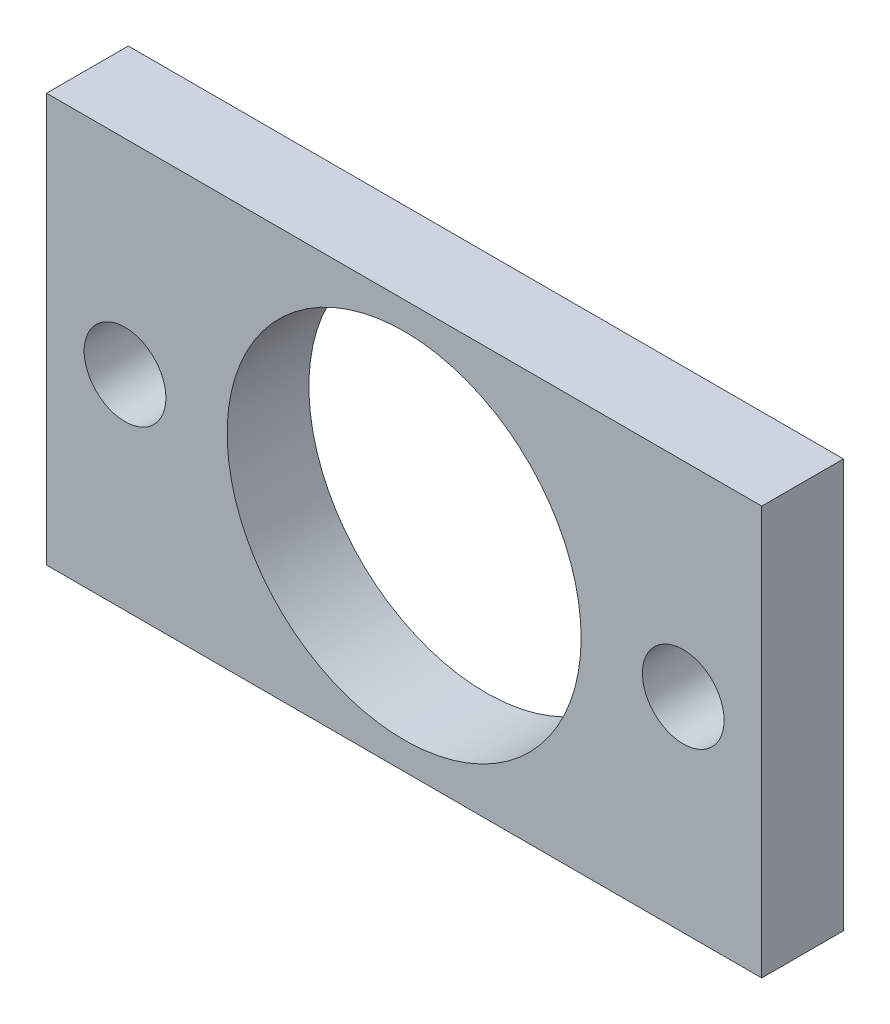
ISO-10303-21;
HEADER;
FILE_DESCRIPTION(('STEP AP214'),'2;1');
FILE_NAME('part.step','',(''),(''),'','','');
FILE_SCHEMA(('AUTOMOTIVE_DESIGN { 1 0 10303 214 1 1 1 1 }'));
ENDSEC;
DATA;
#1=APPLICATION_CONTEXT('core data for automotive mechanical design processes');
#2=APPLICATION_PROTOCOL_DEFINITION('international standard','automotive_design',2000,#1);
#3=PRODUCT_CONTEXT('',#1,'mechanical');
#4=PRODUCT('Part','Part','',(#3));
#5=PRODUCT_RELATED_PRODUCT_CATEGORY('part','',(#4));
#6=PRODUCT_DEFINITION_FORMATION('','',#4);
#7=PRODUCT_DEFINITION_CONTEXT('part definition',#1,'design');
#8=PRODUCT_DEFINITION('design','',#6,#7);
#9=PRODUCT_DEFINITION_SHAPE('','',#8);
#10=(LENGTH_UNIT() NAMED_UNIT(*) SI_UNIT(.MILLI.,.METRE.));
#11=(NAMED_UNIT(*) PLANE_ANGLE_UNIT() SI_UNIT($,.RADIAN.));
#12=(NAMED_UNIT(*) SI_UNIT($,.STERADIAN.) SOLID_ANGLE_UNIT());
#13=UNCERTAINTY_MEASURE_WITH_UNIT(LENGTH_MEASURE(1.E-05),#10,'distance_accuracy_value','');
#14=(GEOMETRIC_REPRESENTATION_CONTEXT(3) GLOBAL_UNCERTAINTY_ASSIGNED_CONTEXT((#13)) GLOBAL_UNIT_ASSIGNED_CONTEXT((#10,
#11,#12)) REPRESENTATION_CONTEXT('',''));
#15=CARTESIAN_POINT('',(0.,0.,0.));
#16=DIRECTION('',(0.,0.,1.));
#17=DIRECTION('',(1.,0.,0.));
#18=AXIS2_PLACEMENT_3D('',#15,#16,#17);
#19=CARTESIAN_POINT('',(0.,-12.7,5.08));
#20=DIRECTION('',(0.,1.,0.));
#21=DIRECTION('',(-1.,0.,0.));
#22=AXIS2_PLACEMENT_3D('',#19,#20,#21);
#23=PLANE('',#22);
#24=DIRECTION('',(1.,0.,0.));
#25=VECTOR('',#24,1.);
#26=CARTESIAN_POINT('',(0.,-12.7,0.));
#27=LINE('',#26,#25);
#28=CARTESIAN_POINT('',(-22.225,-12.7,0.));
#29=VERTEX_POINT('',#28);
#30=CARTESIAN_POINT('',(22.225,-12.7,0.));
#31=VERTEX_POINT('',#30);
#32=EDGE_CURVE('E106',#29,#31,#27,.T.);
#33=ORIENTED_EDGE('',*,*,#32,.T.);
#34=DIRECTION('',(0.,0.,-1.));
#35=VECTOR('',#34,1.);
#36=CARTESIAN_POINT('',(22.225,-12.7,5.08));
#37=LINE('',#36,#35);
#38=CARTESIAN_POINT('',(22.225,-12.7,5.08));
#39=VERTEX_POINT('',#38);
#40=EDGE_CURVE('E11',#39,#31,#37,.T.);
#41=ORIENTED_EDGE('',*,*,#40,.F.);
#42=DIRECTION('',(1.,0.,0.));
#43=VECTOR('',#42,1.);
#44=CARTESIAN_POINT('',(0.,-12.7,5.08));
#45=LINE('',#44,#43);
#46=CARTESIAN_POINT('',(-22.225,-12.7,5.08));
#47=VERTEX_POINT('',#46);
#48=EDGE_CURVE('E83',#47,#39,#45,.T.);
#49=ORIENTED_EDGE('',*,*,#48,.F.);
#50=DIRECTION('',(0.,0.,-1.));
#51=VECTOR('',#50,1.);
#52=CARTESIAN_POINT('',(-22.225,-12.7,5.08));
#53=LINE('',#52,#51);
#54=EDGE_CURVE('E49',#47,#29,#53,.T.);
#55=ORIENTED_EDGE('',*,*,#54,.T.);
#56=EDGE_LOOP('',(#33,#41,#49,#55));
#57=FACE_BOUND('',#56,.T.);
#58=ADVANCED_FACE('F33',(#57),#23,.F.);
#59=CARTESIAN_POINT('',(22.225,0.,5.08));
#60=DIRECTION('',(-1.,0.,0.));
#61=DIRECTION('',(0.,0.,1.));
#62=AXIS2_PLACEMENT_3D('',#59,#60,#61);
#63=PLANE('',#62);
#64=DIRECTION('',(0.,1.,0.));
#65=VECTOR('',#64,1.);
#66=CARTESIAN_POINT('',(22.225,0.,0.));
#67=LINE('',#66,#65);
#68=CARTESIAN_POINT('',(22.225,12.7,0.));
#69=VERTEX_POINT('',#68);
#70=EDGE_CURVE('E88',#31,#69,#67,.T.);
#71=ORIENTED_EDGE('',*,*,#70,.T.);
#72=DIRECTION('',(0.,0.,-1.));
#73=VECTOR('',#72,1.);
#74=CARTESIAN_POINT('',(22.225,12.7,5.08));
#75=LINE('',#74,#73);
#76=CARTESIAN_POINT('',(22.225,12.7,5.08));
#77=VERTEX_POINT('',#76);
#78=EDGE_CURVE('E41',#77,#69,#75,.T.);
#79=ORIENTED_EDGE('',*,*,#78,.F.);
#80=DIRECTION('',(0.,1.,0.));
#81=VECTOR('',#80,1.);
#82=CARTESIAN_POINT('',(22.225,0.,5.08));
#83=LINE('',#82,#81);
#84=EDGE_CURVE('E74',#39,#77,#83,.T.);
#85=ORIENTED_EDGE('',*,*,#84,.F.);
#86=ORIENTED_EDGE('',*,*,#40,.T.);
#87=EDGE_LOOP('',(#71,#79,#85,#86));
#88=FACE_BOUND('',#87,.T.);
#89=ADVANCED_FACE('F87',(#88),#63,.F.);
#90=CARTESIAN_POINT('',(0.,12.7,5.08));
#91=DIRECTION('',(0.,1.,0.));
#92=DIRECTION('',(0.,0.,1.));
#93=AXIS2_PLACEMENT_3D('',#90,#91,#92);
#94=PLANE('',#93);
#95=DIRECTION('',(1.,0.,0.));
#96=VECTOR('',#95,1.);
#97=CARTESIAN_POINT('',(0.,12.7,0.));
#98=LINE('',#97,#96);
#99=CARTESIAN_POINT('',(-22.225,12.7,0.));
#100=VERTEX_POINT('',#99);
#101=EDGE_CURVE('E109',#100,#69,#98,.T.);
#102=ORIENTED_EDGE('',*,*,#101,.F.);
#103=DIRECTION('',(0.,0.,-1.));
#104=VECTOR('',#103,1.);
#105=CARTESIAN_POINT('',(-22.225,12.7,5.08));
#106=LINE('',#105,#104);
#107=CARTESIAN_POINT('',(-22.225,12.7,5.08));
#108=VERTEX_POINT('',#107);
#109=EDGE_CURVE('E63',#108,#100,#106,.T.);
#110=ORIENTED_EDGE('',*,*,#109,.F.);
#111=DIRECTION('',(1.,0.,0.));
#112=VECTOR('',#111,1.);
#113=CARTESIAN_POINT('',(0.,12.7,5.08));
#114=LINE('',#113,#112);
#115=EDGE_CURVE('E82',#108,#77,#114,.T.);
#116=ORIENTED_EDGE('',*,*,#115,.T.);
#117=ORIENTED_EDGE('',*,*,#78,.T.);
#118=EDGE_LOOP('',(#102,#110,#116,#117));
#119=FACE_BOUND('',#118,.T.);
#120=ADVANCED_FACE('F91',(#119),#94,.T.);
#121=CARTESIAN_POINT('',(-17.3462810913037,0.,5.08));
#122=DIRECTION('',(0.,0.,-1.));
#123=DIRECTION('',(-1.,0.,0.));
#124=AXIS2_PLACEMENT_3D('',#121,#122,#123);
#125=CYLINDRICAL_SURFACE('',#124,2.54);
#126=CARTESIAN_POINT('',(-17.3462810913037,0.,5.08));
#127=DIRECTION('',(0.,0.,1.));
#128=DIRECTION('',(1.,0.,0.));
#129=AXIS2_PLACEMENT_3D('',#126,#127,#128);
#130=CIRCLE('',#129,2.54);
#131=CARTESIAN_POINT('',(-14.8062810913037,0.,5.08));
#132=VERTEX_POINT('',#131);
#133=EDGE_CURVE('E100',#132,#132,#130,.T.);
#134=ORIENTED_EDGE('',*,*,#133,.T.);
#135=EDGE_LOOP('',(#134));
#136=FACE_BOUND('',#135,.T.);
#137=CARTESIAN_POINT('',(-17.3462810913037,0.,0.));
#138=DIRECTION('',(0.,0.,1.));
#139=DIRECTION('',(1.,0.,0.));
#140=AXIS2_PLACEMENT_3D('',#137,#138,#139);
#141=CIRCLE('',#140,2.54);
#142=CARTESIAN_POINT('',(-14.8062810913037,0.,0.));
#143=VERTEX_POINT('',#142);
#144=EDGE_CURVE('E117',#143,#143,#141,.T.);
#145=ORIENTED_EDGE('',*,*,#144,.F.);
#146=EDGE_LOOP('',(#145));
#147=FACE_BOUND('',#146,.T.);
#148=ADVANCED_FACE('F151',(#136,#147),#125,.F.);
#149=CARTESIAN_POINT('',(0.,0.,5.08));
#150=DIRECTION('',(0.,0.,-1.));
#151=DIRECTION('',(-1.,0.,0.));
#152=AXIS2_PLACEMENT_3D('',#149,#150,#151);
#153=CYLINDRICAL_SURFACE('',#152,11.);
#154=CARTESIAN_POINT('',(0.,0.,5.08));
#155=DIRECTION('',(0.,0.,1.));
#156=DIRECTION('',(1.,0.,0.));
#157=AXIS2_PLACEMENT_3D('',#154,#155,#156);
#158=CIRCLE('',#157,11.);
#159=CARTESIAN_POINT('',(11.,0.,5.08));
#160=VERTEX_POINT('',#159);
#161=EDGE_CURVE('E94',#160,#160,#158,.T.);
#162=ORIENTED_EDGE('',*,*,#161,.T.);
#163=EDGE_LOOP('',(#162));
#164=FACE_BOUND('',#163,.T.);
#165=CARTESIAN_POINT('',(0.,0.,0.));
#166=DIRECTION('',(0.,0.,1.));
#167=DIRECTION('',(1.,0.,0.));
#168=AXIS2_PLACEMENT_3D('',#165,#166,#167);
#169=CIRCLE('',#168,11.);
#170=CARTESIAN_POINT('',(11.,0.,0.));
#171=VERTEX_POINT('',#170);
#172=EDGE_CURVE('E114',#171,#171,#169,.T.);
#173=ORIENTED_EDGE('',*,*,#172,.F.);
#174=EDGE_LOOP('',(#173));
#175=FACE_BOUND('',#174,.T.);
#176=ADVANCED_FACE('F144',(#164,#175),#153,.F.);
#177=CARTESIAN_POINT('',(-22.225,0.,5.08));
#178=DIRECTION('',(-1.,0.,0.));
#179=DIRECTION('',(0.,0.,1.));
#180=AXIS2_PLACEMENT_3D('',#177,#178,#179);
#181=PLANE('',#180);
#182=DIRECTION('',(0.,1.,0.));
#183=VECTOR('',#182,1.);
#184=CARTESIAN_POINT('',(-22.225,0.,0.));
#185=LINE('',#184,#183);
#186=EDGE_CURVE('E111',#29,#100,#185,.T.);
#187=ORIENTED_EDGE('',*,*,#186,.F.);
#188=ORIENTED_EDGE('',*,*,#54,.F.);
#189=DIRECTION('',(0.,1.,0.));
#190=VECTOR('',#189,1.);
#191=CARTESIAN_POINT('',(-22.225,0.,5.08));
#192=LINE('',#191,#190);
#193=EDGE_CURVE('E92',#47,#108,#192,.T.);
#194=ORIENTED_EDGE('',*,*,#193,.T.);
#195=ORIENTED_EDGE('',*,*,#109,.T.);
#196=EDGE_LOOP('',(#187,#188,#194,#195));
#197=FACE_BOUND('',#196,.T.);
#198=ADVANCED_FACE('F142',(#197),#181,.T.);
#199=CARTESIAN_POINT('',(17.3462810913035,-1.52655665885959E-13,5.08));
#200=DIRECTION('',(0.,0.,-1.));
#201=DIRECTION('',(-1.,0.,0.));
#202=AXIS2_PLACEMENT_3D('',#199,#200,#201);
#203=CYLINDRICAL_SURFACE('',#202,2.54);
#204=CARTESIAN_POINT('',(17.3462810913035,-1.52655665885959E-13,5.08));
#205=DIRECTION('',(0.,0.,1.));
#206=DIRECTION('',(1.,0.,0.));
#207=AXIS2_PLACEMENT_3D('',#204,#205,#206);
#208=CIRCLE('',#207,2.54);
#209=CARTESIAN_POINT('',(19.8862810913035,-1.52655665885959E-13,5.08));
#210=VERTEX_POINT('',#209);
#211=EDGE_CURVE('E103',#210,#210,#208,.F.);
#212=ORIENTED_EDGE('',*,*,#211,.F.);
#213=EDGE_LOOP('',(#212));
#214=FACE_BOUND('',#213,.T.);
#215=CARTESIAN_POINT('',(17.3462810913035,-1.52655665885959E-13,0.));
#216=DIRECTION('',(0.,0.,1.));
#217=DIRECTION('',(1.,0.,0.));
#218=AXIS2_PLACEMENT_3D('',#215,#216,#217);
#219=CIRCLE('',#218,2.54);
#220=CARTESIAN_POINT('',(19.8862810913035,-1.52655665885959E-13,0.));
#221=VERTEX_POINT('',#220);
#222=EDGE_CURVE('E120',#221,#221,#219,.F.);
#223=ORIENTED_EDGE('',*,*,#222,.T.);
#224=EDGE_LOOP('',(#223));
#225=FACE_BOUND('',#224,.T.);
#226=ADVANCED_FACE('F126',(#214,#225),#203,.F.);
#227=CARTESIAN_POINT('',(0.,0.,5.08));
#228=DIRECTION('',(0.,0.,1.));
#229=DIRECTION('',(1.,0.,0.));
#230=AXIS2_PLACEMENT_3D('',#227,#228,#229);
#231=PLANE('',#230);
#232=ORIENTED_EDGE('',*,*,#48,.T.);
#233=ORIENTED_EDGE('',*,*,#84,.T.);
#234=ORIENTED_EDGE('',*,*,#115,.F.);
#235=ORIENTED_EDGE('',*,*,#193,.F.);
#236=EDGE_LOOP('',(#232,#233,#234,#235));
#237=FACE_BOUND('',#236,.T.);
#238=ORIENTED_EDGE('',*,*,#161,.F.);
#239=EDGE_LOOP('',(#238));
#240=FACE_BOUND('',#239,.T.);
#241=ORIENTED_EDGE('',*,*,#133,.F.);
#242=EDGE_LOOP('',(#241));
#243=FACE_BOUND('',#242,.T.);
#244=ORIENTED_EDGE('',*,*,#211,.T.);
#245=EDGE_LOOP('',(#244));
#246=FACE_BOUND('',#245,.T.);
#247=ADVANCED_FACE('F78',(#237,#240,#243,#246),#231,.T.);
#248=CARTESIAN_POINT('',(0.,0.,0.));
#249=DIRECTION('',(0.,0.,1.));
#250=DIRECTION('',(1.,0.,0.));
#251=AXIS2_PLACEMENT_3D('',#248,#249,#250);
#252=PLANE('',#251);
#253=ORIENTED_EDGE('',*,*,#32,.F.);
#254=ORIENTED_EDGE('',*,*,#186,.T.);
#255=ORIENTED_EDGE('',*,*,#101,.T.);
#256=ORIENTED_EDGE('',*,*,#70,.F.);
#257=EDGE_LOOP('',(#253,#254,#255,#256));
#258=FACE_BOUND('',#257,.T.);
#259=ORIENTED_EDGE('',*,*,#172,.T.);
#260=EDGE_LOOP('',(#259));
#261=FACE_BOUND('',#260,.T.);
#262=ORIENTED_EDGE('',*,*,#144,.T.);
#263=EDGE_LOOP('',(#262));
#264=FACE_BOUND('',#263,.T.);
#265=ORIENTED_EDGE('',*,*,#222,.F.);
#266=EDGE_LOOP('',(#265));
#267=FACE_BOUND('',#266,.T.);
#268=ADVANCED_FACE('F128',(#258,#261,#264,#267),#252,.F.);
#269=CLOSED_SHELL('',(#58,#89,#120,#148,#176,#198,#226,#247,#268));
#270=MANIFOLD_SOLID_BREP('B2',#269);
#271=ADVANCED_BREP_SHAPE_REPRESENTATION('',(#18,#270),#14);
#272=SHAPE_DEFINITION_REPRESENTATION(#9,#271);
ENDSEC;
END-ISO-10303-21;
